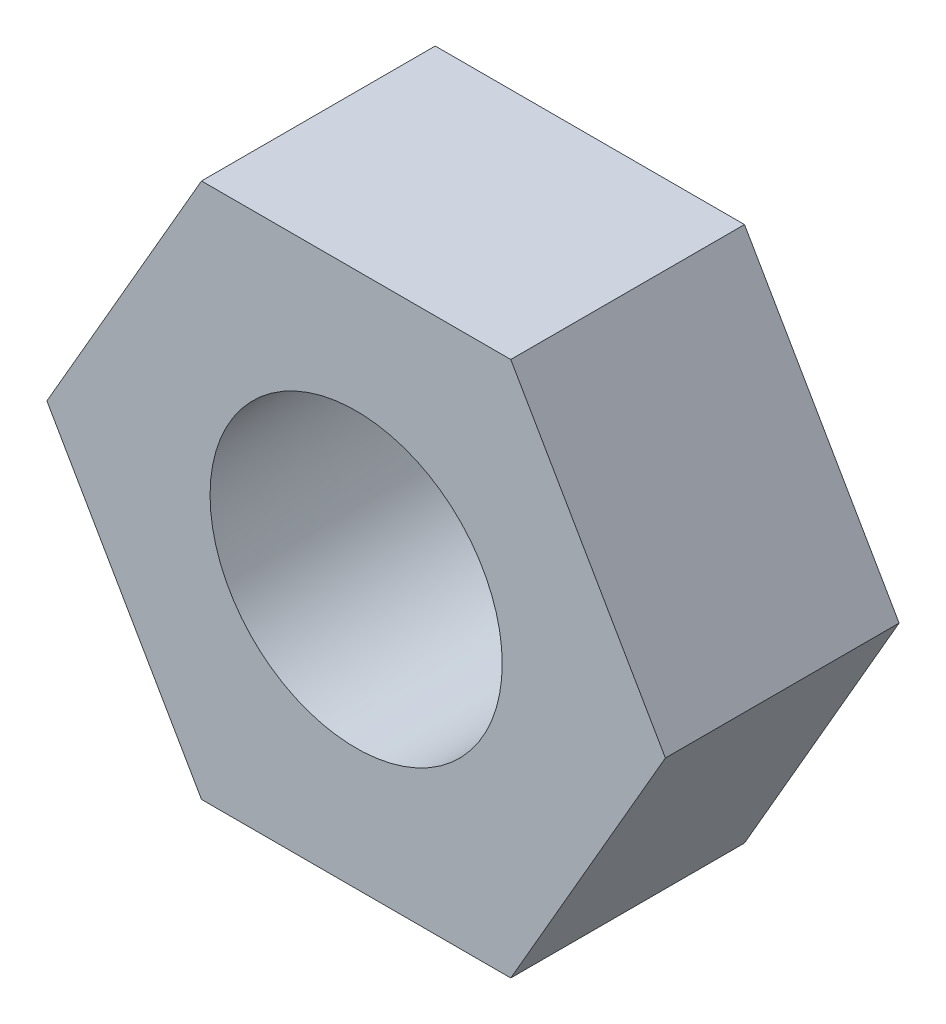
ISO-10303-21;
HEADER;
FILE_DESCRIPTION(('STEP AP214'),'2;1');
FILE_NAME('part.step','',(''),(''),'','','');
FILE_SCHEMA(('AUTOMOTIVE_DESIGN { 1 0 10303 214 1 1 1 1 }'));
ENDSEC;
DATA;
#1=APPLICATION_CONTEXT('core data for automotive mechanical design processes');
#2=APPLICATION_PROTOCOL_DEFINITION('international standard','automotive_design',2000,#1);
#3=PRODUCT_CONTEXT('',#1,'mechanical');
#4=PRODUCT('Part','Part','',(#3));
#5=PRODUCT_RELATED_PRODUCT_CATEGORY('part','',(#4));
#6=PRODUCT_DEFINITION_FORMATION('','',#4);
#7=PRODUCT_DEFINITION_CONTEXT('part definition',#1,'design');
#8=PRODUCT_DEFINITION('design','',#6,#7);
#9=PRODUCT_DEFINITION_SHAPE('','',#8);
#10=(LENGTH_UNIT() NAMED_UNIT(*) SI_UNIT(.MILLI.,.METRE.));
#11=(NAMED_UNIT(*) PLANE_ANGLE_UNIT() SI_UNIT($,.RADIAN.));
#12=(NAMED_UNIT(*) SI_UNIT($,.STERADIAN.) SOLID_ANGLE_UNIT());
#13=UNCERTAINTY_MEASURE_WITH_UNIT(LENGTH_MEASURE(1.E-05),#10,'distance_accuracy_value','');
#14=(GEOMETRIC_REPRESENTATION_CONTEXT(3) GLOBAL_UNCERTAINTY_ASSIGNED_CONTEXT((#13)) GLOBAL_UNIT_ASSIGNED_CONTEXT((#10,
#11,#12)) REPRESENTATION_CONTEXT('',''));
#15=CARTESIAN_POINT('',(0.,0.,0.));
#16=DIRECTION('',(0.,0.,1.));
#17=DIRECTION('',(1.,0.,0.));
#18=AXIS2_PLACEMENT_3D('',#15,#16,#17);
#19=CARTESIAN_POINT('',(0.,0.,2.4));
#20=DIRECTION('',(0.,0.,1.));
#21=DIRECTION('',(1.,0.,0.));
#22=AXIS2_PLACEMENT_3D('',#19,#20,#21);
#23=PLANE('',#22);
#24=DIRECTION('',(0.5,0.866025403784439,0.));
#25=VECTOR('',#24,1.);
#26=CARTESIAN_POINT('',(1.58771324027147,-2.75,2.4));
#27=LINE('',#26,#25);
#28=CARTESIAN_POINT('',(1.58771324027147,-2.75,2.4));
#29=VERTEX_POINT('',#28);
#30=CARTESIAN_POINT('',(3.17542648054294,0.,2.4));
#31=VERTEX_POINT('',#30);
#32=EDGE_CURVE('E137',#29,#31,#27,.T.);
#33=ORIENTED_EDGE('',*,*,#32,.T.);
#34=DIRECTION('',(-0.5,0.866025403784439,0.));
#35=VECTOR('',#34,1.);
#36=CARTESIAN_POINT('',(3.17542648054294,0.,2.4));
#37=LINE('',#36,#35);
#38=CARTESIAN_POINT('',(1.58771324027147,2.75,2.4));
#39=VERTEX_POINT('',#38);
#40=EDGE_CURVE('E100',#31,#39,#37,.T.);
#41=ORIENTED_EDGE('',*,*,#40,.T.);
#42=DIRECTION('',(-1.,0.,0.));
#43=VECTOR('',#42,1.);
#44=CARTESIAN_POINT('',(1.58771324027147,2.75,2.4));
#45=LINE('',#44,#43);
#46=CARTESIAN_POINT('',(-1.58771324027147,2.75,2.4));
#47=VERTEX_POINT('',#46);
#48=EDGE_CURVE('E110',#39,#47,#45,.T.);
#49=ORIENTED_EDGE('',*,*,#48,.T.);
#50=DIRECTION('',(-0.5,-0.866025403784438,0.));
#51=VECTOR('',#50,1.);
#52=CARTESIAN_POINT('',(-1.58771324027147,2.75,2.4));
#53=LINE('',#52,#51);
#54=CARTESIAN_POINT('',(-3.17542648054294,0.,2.4));
#55=VERTEX_POINT('',#54);
#56=EDGE_CURVE('E101',#47,#55,#53,.T.);
#57=ORIENTED_EDGE('',*,*,#56,.T.);
#58=DIRECTION('',(0.5,-0.866025403784439,0.));
#59=VECTOR('',#58,1.);
#60=CARTESIAN_POINT('',(-3.17542648054294,0.,2.4));
#61=LINE('',#60,#59);
#62=CARTESIAN_POINT('',(-1.58771324027147,-2.75,2.4));
#63=VERTEX_POINT('',#62);
#64=EDGE_CURVE('E109',#55,#63,#61,.T.);
#65=ORIENTED_EDGE('',*,*,#64,.T.);
#66=DIRECTION('',(1.,0.,0.));
#67=VECTOR('',#66,1.);
#68=CARTESIAN_POINT('',(-1.58771324027147,-2.75,2.4));
#69=LINE('',#68,#67);
#70=EDGE_CURVE('E58',#63,#29,#69,.T.);
#71=ORIENTED_EDGE('',*,*,#70,.T.);
#72=EDGE_LOOP('',(#33,#41,#49,#57,#65,#71));
#73=FACE_BOUND('',#72,.T.);
#74=CARTESIAN_POINT('',(0.,0.,2.4));
#75=DIRECTION('',(0.,0.,1.));
#76=DIRECTION('',(1.,0.,0.));
#77=AXIS2_PLACEMENT_3D('',#74,#75,#76);
#78=CIRCLE('',#77,1.5);
#79=CARTESIAN_POINT('',(1.5,0.,2.4));
#80=VERTEX_POINT('',#79);
#81=EDGE_CURVE('E135',#80,#80,#78,.T.);
#82=ORIENTED_EDGE('',*,*,#81,.F.);
#83=EDGE_LOOP('',(#82));
#84=FACE_BOUND('',#83,.T.);
#85=ADVANCED_FACE('F43',(#73,#84),#23,.T.);
#86=CARTESIAN_POINT('',(0.,0.,0.));
#87=DIRECTION('',(0.,0.,1.));
#88=DIRECTION('',(1.,0.,0.));
#89=AXIS2_PLACEMENT_3D('',#86,#87,#88);
#90=PLANE('',#89);
#91=DIRECTION('',(0.5,0.866025403784439,0.));
#92=VECTOR('',#91,1.);
#93=CARTESIAN_POINT('',(1.58771324027147,-2.75,0.));
#94=LINE('',#93,#92);
#95=CARTESIAN_POINT('',(1.58771324027147,-2.75,0.));
#96=VERTEX_POINT('',#95);
#97=CARTESIAN_POINT('',(3.17542648054294,0.,0.));
#98=VERTEX_POINT('',#97);
#99=EDGE_CURVE('E126',#96,#98,#94,.T.);
#100=ORIENTED_EDGE('',*,*,#99,.F.);
#101=DIRECTION('',(1.,0.,0.));
#102=VECTOR('',#101,1.);
#103=CARTESIAN_POINT('',(-1.58771324027147,-2.75,0.));
#104=LINE('',#103,#102);
#105=CARTESIAN_POINT('',(-1.58771324027147,-2.75,0.));
#106=VERTEX_POINT('',#105);
#107=EDGE_CURVE('E87',#106,#96,#104,.T.);
#108=ORIENTED_EDGE('',*,*,#107,.F.);
#109=DIRECTION('',(0.5,-0.866025403784439,0.));
#110=VECTOR('',#109,1.);
#111=CARTESIAN_POINT('',(-3.17542648054294,0.,0.));
#112=LINE('',#111,#110);
#113=CARTESIAN_POINT('',(-3.17542648054294,0.,0.));
#114=VERTEX_POINT('',#113);
#115=EDGE_CURVE('E81',#114,#106,#112,.T.);
#116=ORIENTED_EDGE('',*,*,#115,.F.);
#117=DIRECTION('',(-0.5,-0.866025403784438,0.));
#118=VECTOR('',#117,1.);
#119=CARTESIAN_POINT('',(-1.58771324027147,2.75,0.));
#120=LINE('',#119,#118);
#121=CARTESIAN_POINT('',(-1.58771324027147,2.75,0.));
#122=VERTEX_POINT('',#121);
#123=EDGE_CURVE('E119',#122,#114,#120,.T.);
#124=ORIENTED_EDGE('',*,*,#123,.F.);
#125=DIRECTION('',(-1.,0.,0.));
#126=VECTOR('',#125,1.);
#127=CARTESIAN_POINT('',(1.58771324027147,2.75,0.));
#128=LINE('',#127,#126);
#129=CARTESIAN_POINT('',(1.58771324027147,2.75,0.));
#130=VERTEX_POINT('',#129);
#131=EDGE_CURVE('E132',#130,#122,#128,.T.);
#132=ORIENTED_EDGE('',*,*,#131,.F.);
#133=DIRECTION('',(-0.5,0.866025403784439,0.));
#134=VECTOR('',#133,1.);
#135=CARTESIAN_POINT('',(3.17542648054294,0.,0.));
#136=LINE('',#135,#134);
#137=EDGE_CURVE('E131',#98,#130,#136,.T.);
#138=ORIENTED_EDGE('',*,*,#137,.F.);
#139=EDGE_LOOP('',(#100,#108,#116,#124,#132,#138));
#140=FACE_BOUND('',#139,.T.);
#141=CARTESIAN_POINT('',(0.,0.,0.));
#142=DIRECTION('',(0.,0.,1.));
#143=DIRECTION('',(1.,0.,0.));
#144=AXIS2_PLACEMENT_3D('',#141,#142,#143);
#145=CIRCLE('',#144,1.5);
#146=CARTESIAN_POINT('',(1.5,0.,0.));
#147=VERTEX_POINT('',#146);
#148=EDGE_CURVE('E235',#147,#147,#145,.T.);
#149=ORIENTED_EDGE('',*,*,#148,.T.);
#150=EDGE_LOOP('',(#149));
#151=FACE_BOUND('',#150,.T.);
#152=ADVANCED_FACE('F149',(#140,#151),#90,.F.);
#153=CARTESIAN_POINT('',(1.58771324027147,-2.75,2.4));
#154=DIRECTION('',(-0.866025403784439,0.5,0.));
#155=DIRECTION('',(-0.5,-0.866025403784439,0.));
#156=AXIS2_PLACEMENT_3D('',#153,#154,#155);
#157=PLANE('',#156);
#158=ORIENTED_EDGE('',*,*,#99,.T.);
#159=DIRECTION('',(0.,0.,-1.));
#160=VECTOR('',#159,1.);
#161=CARTESIAN_POINT('',(3.17542648054294,0.,2.4));
#162=LINE('',#161,#160);
#163=EDGE_CURVE('E11',#31,#98,#162,.T.);
#164=ORIENTED_EDGE('',*,*,#163,.F.);
#165=ORIENTED_EDGE('',*,*,#32,.F.);
#166=DIRECTION('',(0.,0.,-1.));
#167=VECTOR('',#166,1.);
#168=CARTESIAN_POINT('',(1.58771324027147,-2.75,2.4));
#169=LINE('',#168,#167);
#170=EDGE_CURVE('E125',#29,#96,#169,.T.);
#171=ORIENTED_EDGE('',*,*,#170,.T.);
#172=EDGE_LOOP('',(#158,#164,#165,#171));
#173=FACE_BOUND('',#172,.T.);
#174=ADVANCED_FACE('F44',(#173),#157,.F.);
#175=CARTESIAN_POINT('',(3.17542648054294,0.,2.4));
#176=DIRECTION('',(-0.866025403784439,-0.5,0.));
#177=DIRECTION('',(0.5,-0.866025403784439,0.));
#178=AXIS2_PLACEMENT_3D('',#175,#176,#177);
#179=PLANE('',#178);
#180=ORIENTED_EDGE('',*,*,#137,.T.);
#181=DIRECTION('',(0.,0.,-1.));
#182=VECTOR('',#181,1.);
#183=CARTESIAN_POINT('',(1.58771324027147,2.75,2.4));
#184=LINE('',#183,#182);
#185=EDGE_CURVE('E55',#39,#130,#184,.T.);
#186=ORIENTED_EDGE('',*,*,#185,.F.);
#187=ORIENTED_EDGE('',*,*,#40,.F.);
#188=ORIENTED_EDGE('',*,*,#163,.T.);
#189=EDGE_LOOP('',(#180,#186,#187,#188));
#190=FACE_BOUND('',#189,.T.);
#191=ADVANCED_FACE('F171',(#190),#179,.F.);
#192=CARTESIAN_POINT('',(1.58771324027147,2.75,2.4));
#193=DIRECTION('',(0.,-1.,0.));
#194=DIRECTION('',(1.,0.,0.));
#195=AXIS2_PLACEMENT_3D('',#192,#193,#194);
#196=PLANE('',#195);
#197=ORIENTED_EDGE('',*,*,#131,.T.);
#198=DIRECTION('',(0.,0.,-1.));
#199=VECTOR('',#198,1.);
#200=CARTESIAN_POINT('',(-1.58771324027147,2.75,2.4));
#201=LINE('',#200,#199);
#202=EDGE_CURVE('E118',#47,#122,#201,.T.);
#203=ORIENTED_EDGE('',*,*,#202,.F.);
#204=ORIENTED_EDGE('',*,*,#48,.F.);
#205=ORIENTED_EDGE('',*,*,#185,.T.);
#206=EDGE_LOOP('',(#197,#203,#204,#205));
#207=FACE_BOUND('',#206,.T.);
#208=ADVANCED_FACE('F144',(#207),#196,.F.);
#209=CARTESIAN_POINT('',(-1.58771324027147,2.75,2.4));
#210=DIRECTION('',(0.866025403784439,-0.5,0.));
#211=DIRECTION('',(0.5,0.866025403784439,0.));
#212=AXIS2_PLACEMENT_3D('',#209,#210,#211);
#213=PLANE('',#212);
#214=ORIENTED_EDGE('',*,*,#123,.T.);
#215=DIRECTION('',(0.,0.,-1.));
#216=VECTOR('',#215,1.);
#217=CARTESIAN_POINT('',(-3.17542648054294,0.,2.4));
#218=LINE('',#217,#216);
#219=EDGE_CURVE('E113',#55,#114,#218,.T.);
#220=ORIENTED_EDGE('',*,*,#219,.F.);
#221=ORIENTED_EDGE('',*,*,#56,.F.);
#222=ORIENTED_EDGE('',*,*,#202,.T.);
#223=EDGE_LOOP('',(#214,#220,#221,#222));
#224=FACE_BOUND('',#223,.T.);
#225=ADVANCED_FACE('F116',(#224),#213,.F.);
#226=CARTESIAN_POINT('',(-3.17542648054294,0.,2.4));
#227=DIRECTION('',(0.866025403784439,0.5,0.));
#228=DIRECTION('',(-0.5,0.866025403784439,0.));
#229=AXIS2_PLACEMENT_3D('',#226,#227,#228);
#230=PLANE('',#229);
#231=ORIENTED_EDGE('',*,*,#115,.T.);
#232=DIRECTION('',(0.,0.,-1.));
#233=VECTOR('',#232,1.);
#234=CARTESIAN_POINT('',(-1.58771324027147,-2.75,2.4));
#235=LINE('',#234,#233);
#236=EDGE_CURVE('E120',#63,#106,#235,.T.);
#237=ORIENTED_EDGE('',*,*,#236,.F.);
#238=ORIENTED_EDGE('',*,*,#64,.F.);
#239=ORIENTED_EDGE('',*,*,#219,.T.);
#240=EDGE_LOOP('',(#231,#237,#238,#239));
#241=FACE_BOUND('',#240,.T.);
#242=ADVANCED_FACE('F122',(#241),#230,.F.);
#243=CARTESIAN_POINT('',(-1.58771324027147,-2.75,2.4));
#244=DIRECTION('',(0.,1.,0.));
#245=DIRECTION('',(-1.,0.,0.));
#246=AXIS2_PLACEMENT_3D('',#243,#244,#245);
#247=PLANE('',#246);
#248=ORIENTED_EDGE('',*,*,#107,.T.);
#249=ORIENTED_EDGE('',*,*,#170,.F.);
#250=ORIENTED_EDGE('',*,*,#70,.F.);
#251=ORIENTED_EDGE('',*,*,#236,.T.);
#252=EDGE_LOOP('',(#248,#249,#250,#251));
#253=FACE_BOUND('',#252,.T.);
#254=ADVANCED_FACE('F154',(#253),#247,.F.);
#255=CARTESIAN_POINT('',(0.,0.,2.4));
#256=DIRECTION('',(0.,0.,-1.));
#257=DIRECTION('',(-1.,0.,0.));
#258=AXIS2_PLACEMENT_3D('',#255,#256,#257);
#259=CYLINDRICAL_SURFACE('',#258,1.5);
#260=ORIENTED_EDGE('',*,*,#81,.T.);
#261=EDGE_LOOP('',(#260));
#262=FACE_BOUND('',#261,.T.);
#263=ORIENTED_EDGE('',*,*,#148,.F.);
#264=EDGE_LOOP('',(#263));
#265=FACE_BOUND('',#264,.T.);
#266=ADVANCED_FACE('F155',(#262,#265),#259,.F.);
#267=CLOSED_SHELL('',(#85,#152,#174,#191,#208,#225,#242,#254,#266));
#268=MANIFOLD_SOLID_BREP('B2',#267);
#269=ADVANCED_BREP_SHAPE_REPRESENTATION('',(#18,#268),#14);
#270=SHAPE_DEFINITION_REPRESENTATION(#9,#269);
ENDSEC;
END-ISO-10303-21;
